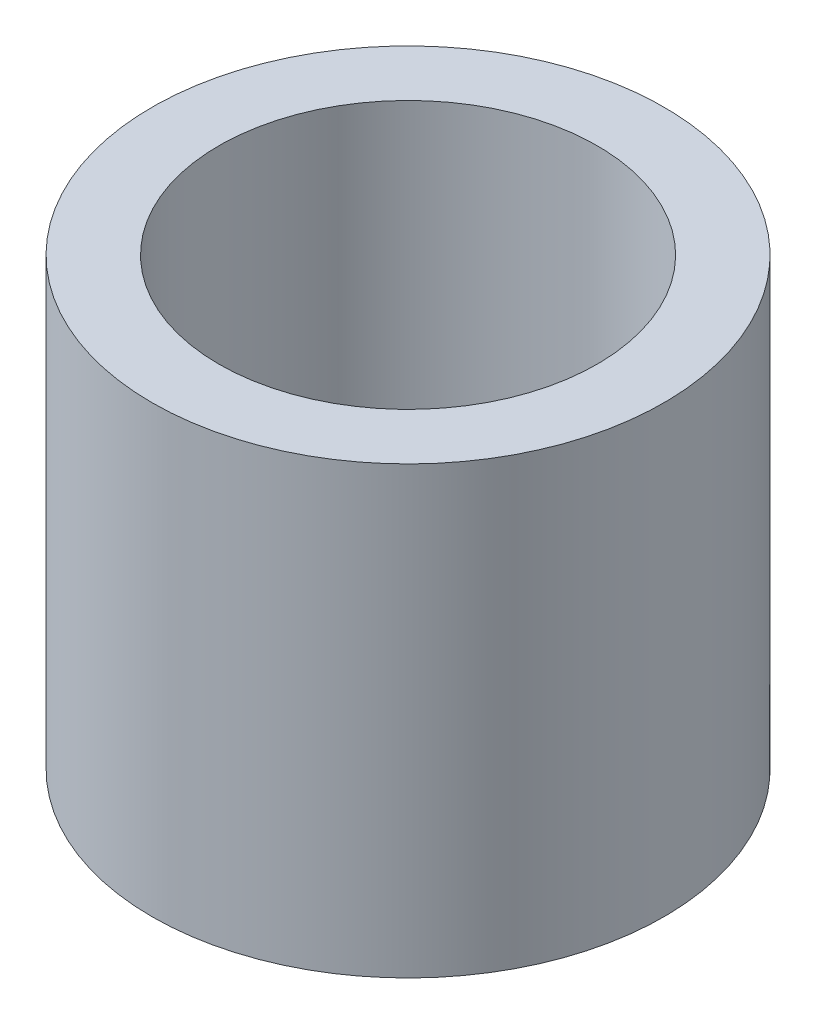
ISO-10303-21;
HEADER;
FILE_DESCRIPTION(('STEP AP214'),'2;1');
FILE_NAME('part.step','',(''),(''),'','','');
FILE_SCHEMA(('AUTOMOTIVE_DESIGN { 1 0 10303 214 1 1 1 1 }'));
ENDSEC;
DATA;
#1=APPLICATION_CONTEXT('core data for automotive mechanical design processes');
#2=APPLICATION_PROTOCOL_DEFINITION('international standard','automotive_design',2000,#1);
#3=PRODUCT_CONTEXT('',#1,'mechanical');
#4=PRODUCT('Part','Part','',(#3));
#5=PRODUCT_RELATED_PRODUCT_CATEGORY('part','',(#4));
#6=PRODUCT_DEFINITION_FORMATION('','',#4);
#7=PRODUCT_DEFINITION_CONTEXT('part definition',#1,'design');
#8=PRODUCT_DEFINITION('design','',#6,#7);
#9=PRODUCT_DEFINITION_SHAPE('','',#8);
#10=(LENGTH_UNIT() NAMED_UNIT(*) SI_UNIT(.MILLI.,.METRE.));
#11=(NAMED_UNIT(*) PLANE_ANGLE_UNIT() SI_UNIT($,.RADIAN.));
#12=(NAMED_UNIT(*) SI_UNIT($,.STERADIAN.) SOLID_ANGLE_UNIT());
#13=UNCERTAINTY_MEASURE_WITH_UNIT(LENGTH_MEASURE(1.E-05),#10,'distance_accuracy_value','');
#14=(GEOMETRIC_REPRESENTATION_CONTEXT(3) GLOBAL_UNCERTAINTY_ASSIGNED_CONTEXT((#13)) GLOBAL_UNIT_ASSIGNED_CONTEXT((#10,
#11,#12)) REPRESENTATION_CONTEXT('',''));
#15=CARTESIAN_POINT('',(0.,0.,0.));
#16=DIRECTION('',(0.,0.,1.));
#17=DIRECTION('',(1.,0.,0.));
#18=AXIS2_PLACEMENT_3D('',#15,#16,#17);
#19=CARTESIAN_POINT('',(0.,6.,0.));
#20=DIRECTION('',(0.,-1.,0.));
#21=DIRECTION('',(0.,0.,-1.));
#22=AXIS2_PLACEMENT_3D('',#19,#20,#21);
#23=CYLINDRICAL_SURFACE('',#22,23.);
#24=CARTESIAN_POINT('',(0.,0.,0.));
#25=DIRECTION('',(0.,1.,0.));
#26=DIRECTION('',(0.,0.,1.));
#27=AXIS2_PLACEMENT_3D('',#24,#25,#26);
#28=CIRCLE('',#27,23.);
#29=CARTESIAN_POINT('',(0.,0.,23.));
#30=VERTEX_POINT('',#29);
#31=EDGE_CURVE('E41',#30,#30,#28,.T.);
#32=ORIENTED_EDGE('',*,*,#31,.T.);
#33=EDGE_LOOP('',(#32));
#34=FACE_BOUND('',#33,.T.);
#35=CARTESIAN_POINT('',(0.,40.,0.));
#36=DIRECTION('',(0.,1.,0.));
#37=DIRECTION('',(0.,0.,1.));
#38=AXIS2_PLACEMENT_3D('',#35,#36,#37);
#39=CIRCLE('',#38,23.);
#40=CARTESIAN_POINT('',(0.,40.,23.));
#41=VERTEX_POINT('',#40);
#42=EDGE_CURVE('E45',#41,#41,#39,.T.);
#43=ORIENTED_EDGE('',*,*,#42,.F.);
#44=EDGE_LOOP('',(#43));
#45=FACE_BOUND('',#44,.T.);
#46=ADVANCED_FACE('F35',(#34,#45),#23,.T.);
#47=CARTESIAN_POINT('',(0.,0.,0.));
#48=DIRECTION('',(0.,1.,0.));
#49=DIRECTION('',(0.,0.,1.));
#50=AXIS2_PLACEMENT_3D('',#47,#48,#49);
#51=PLANE('',#50);
#52=ORIENTED_EDGE('',*,*,#31,.F.);
#53=EDGE_LOOP('',(#52));
#54=FACE_BOUND('',#53,.T.);
#55=ADVANCED_FACE('F59',(#54),#51,.F.);
#56=CARTESIAN_POINT('',(0.,40.,0.));
#57=DIRECTION('',(0.,1.,0.));
#58=DIRECTION('',(0.,0.,1.));
#59=AXIS2_PLACEMENT_3D('',#56,#57,#58);
#60=PLANE('',#59);
#61=ORIENTED_EDGE('',*,*,#42,.T.);
#62=EDGE_LOOP('',(#61));
#63=FACE_BOUND('',#62,.T.);
#64=CARTESIAN_POINT('',(0.,40.,0.));
#65=DIRECTION('',(0.,1.,0.));
#66=DIRECTION('',(0.,0.,1.));
#67=AXIS2_PLACEMENT_3D('',#64,#65,#66);
#68=CIRCLE('',#67,17.);
#69=CARTESIAN_POINT('',(0.,40.,17.));
#70=VERTEX_POINT('',#69);
#71=EDGE_CURVE('E49',#70,#70,#68,.T.);
#72=ORIENTED_EDGE('',*,*,#71,.F.);
#73=EDGE_LOOP('',(#72));
#74=FACE_BOUND('',#73,.T.);
#75=ADVANCED_FACE('F57',(#63,#74),#60,.T.);
#76=CARTESIAN_POINT('',(0.,40.,0.));
#77=DIRECTION('',(0.,-1.,0.));
#78=DIRECTION('',(0.,0.,-1.));
#79=AXIS2_PLACEMENT_3D('',#76,#77,#78);
#80=CYLINDRICAL_SURFACE('',#79,17.);
#81=ORIENTED_EDGE('',*,*,#71,.T.);
#82=EDGE_LOOP('',(#81));
#83=FACE_BOUND('',#82,.T.);
#84=CARTESIAN_POINT('',(0.,6.,0.));
#85=DIRECTION('',(0.,1.,0.));
#86=DIRECTION('',(0.,0.,1.));
#87=AXIS2_PLACEMENT_3D('',#84,#85,#86);
#88=CIRCLE('',#87,17.);
#89=CARTESIAN_POINT('',(0.,6.,17.));
#90=VERTEX_POINT('',#89);
#91=EDGE_CURVE('E10',#90,#90,#88,.F.);
#92=ORIENTED_EDGE('',*,*,#91,.T.);
#93=EDGE_LOOP('',(#92));
#94=FACE_BOUND('',#93,.T.);
#95=ADVANCED_FACE('F55',(#83,#94),#80,.F.);
#96=CARTESIAN_POINT('',(0.,6.,0.));
#97=DIRECTION('',(0.,1.,0.));
#98=DIRECTION('',(0.,0.,1.));
#99=AXIS2_PLACEMENT_3D('',#96,#97,#98);
#100=PLANE('',#99);
#101=ORIENTED_EDGE('',*,*,#91,.F.);
#102=EDGE_LOOP('',(#101));
#103=FACE_BOUND('',#102,.T.);
#104=ADVANCED_FACE('F66',(#103),#100,.T.);
#105=CLOSED_SHELL('',(#46,#55,#75,#95,#104));
#106=MANIFOLD_SOLID_BREP('B2',#105);
#107=ADVANCED_BREP_SHAPE_REPRESENTATION('',(#18,#106),#14);
#108=SHAPE_DEFINITION_REPRESENTATION(#9,#107);
ENDSEC;
END-ISO-10303-21;
